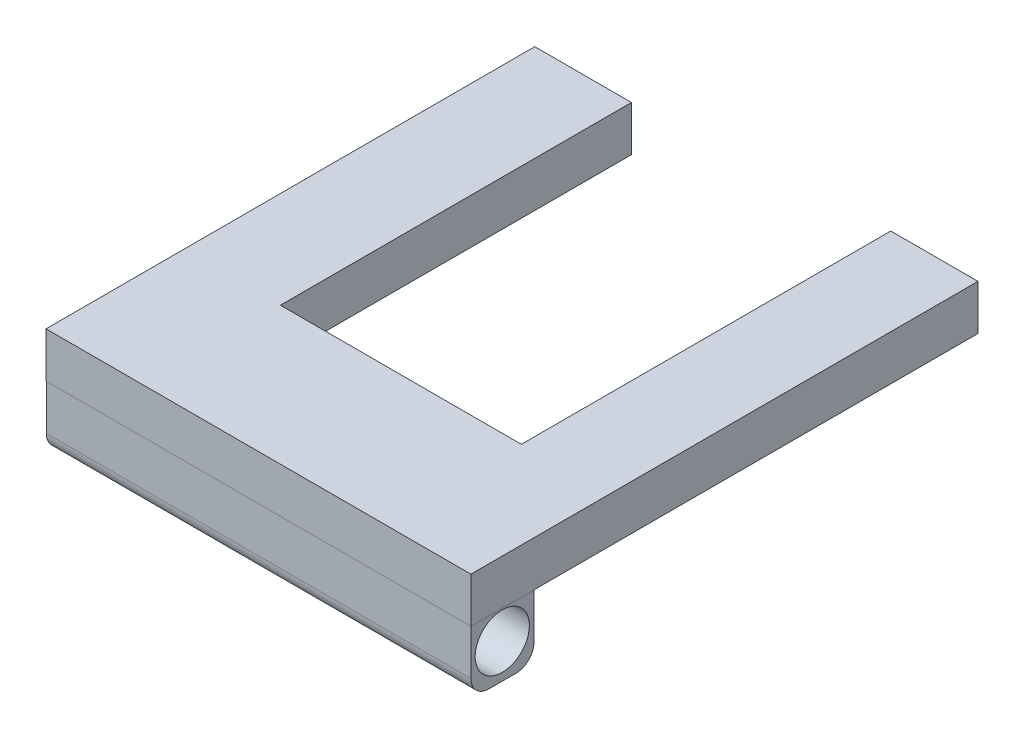
ISO-10303-21;
HEADER;
FILE_DESCRIPTION(('STEP AP214'),'2;1');
FILE_NAME('part.step','',(''),(''),'','','');
FILE_SCHEMA(('AUTOMOTIVE_DESIGN { 1 0 10303 214 1 1 1 1 }'));
ENDSEC;
DATA;
#1=APPLICATION_CONTEXT('core data for automotive mechanical design processes');
#2=APPLICATION_PROTOCOL_DEFINITION('international standard','automotive_design',2000,#1);
#3=PRODUCT_CONTEXT('',#1,'mechanical');
#4=PRODUCT('Part','Part','',(#3));
#5=PRODUCT_RELATED_PRODUCT_CATEGORY('part','',(#4));
#6=PRODUCT_DEFINITION_FORMATION('','',#4);
#7=PRODUCT_DEFINITION_CONTEXT('part definition',#1,'design');
#8=PRODUCT_DEFINITION('design','',#6,#7);
#9=PRODUCT_DEFINITION_SHAPE('','',#8);
#10=(LENGTH_UNIT() NAMED_UNIT(*) SI_UNIT(.MILLI.,.METRE.));
#11=(NAMED_UNIT(*) PLANE_ANGLE_UNIT() SI_UNIT($,.RADIAN.));
#12=(NAMED_UNIT(*) SI_UNIT($,.STERADIAN.) SOLID_ANGLE_UNIT());
#13=UNCERTAINTY_MEASURE_WITH_UNIT(LENGTH_MEASURE(1.E-05),#10,'distance_accuracy_value','');
#14=(GEOMETRIC_REPRESENTATION_CONTEXT(3) GLOBAL_UNCERTAINTY_ASSIGNED_CONTEXT((#13)) GLOBAL_UNIT_ASSIGNED_CONTEXT((#10,
#11,#12)) REPRESENTATION_CONTEXT('',''));
#15=CARTESIAN_POINT('',(0.,0.,0.));
#16=DIRECTION('',(0.,0.,1.));
#17=DIRECTION('',(1.,0.,0.));
#18=AXIS2_PLACEMENT_3D('',#15,#16,#17);
#19=CARTESIAN_POINT('',(0.0296784492588645,0.,54.1020000000002));
#20=DIRECTION('',(0.,0.,1.));
#21=DIRECTION('',(1.,0.,0.));
#22=AXIS2_PLACEMENT_3D('',#19,#20,#21);
#23=PLANE('',#22);
#24=DIRECTION('',(0.,-1.,0.));
#25=VECTOR('',#24,1.);
#26=CARTESIAN_POINT('',(0.0296784492588645,0.,54.1020000000002));
#27=LINE('',#26,#25);
#28=CARTESIAN_POINT('',(0.0296784492588645,0.,54.1020000000002));
#29=VERTEX_POINT('',#28);
#30=CARTESIAN_POINT('',(0.0296784492588645,-5.,54.1020000000002));
#31=VERTEX_POINT('',#30);
#32=EDGE_CURVE('E122',#29,#31,#27,.T.);
#33=ORIENTED_EDGE('',*,*,#32,.T.);
#34=DIRECTION('',(1.,0.,0.));
#35=VECTOR('',#34,1.);
#36=CARTESIAN_POINT('',(0.0296784492588645,-5.,54.1020000000002));
#37=LINE('',#36,#35);
#38=CARTESIAN_POINT('',(47.0296784492589,-5.,54.102));
#39=VERTEX_POINT('',#38);
#40=EDGE_CURVE('E12',#31,#39,#37,.T.);
#41=ORIENTED_EDGE('',*,*,#40,.T.);
#42=DIRECTION('',(0.,-1.,0.));
#43=VECTOR('',#42,1.);
#44=CARTESIAN_POINT('',(47.0296784492589,0.,54.102));
#45=LINE('',#44,#43);
#46=CARTESIAN_POINT('',(47.0296784492589,0.,54.102));
#47=VERTEX_POINT('',#46);
#48=EDGE_CURVE('E123',#47,#39,#45,.T.);
#49=ORIENTED_EDGE('',*,*,#48,.F.);
#50=DIRECTION('',(1.,0.,0.));
#51=VECTOR('',#50,1.);
#52=CARTESIAN_POINT('',(0.0296784492588645,0.,54.1020000000002));
#53=LINE('',#52,#51);
#54=EDGE_CURVE('E117',#29,#47,#53,.T.);
#55=ORIENTED_EDGE('',*,*,#54,.F.);
#56=EDGE_LOOP('',(#33,#41,#49,#55));
#57=FACE_BOUND('',#56,.T.);
#58=ADVANCED_FACE('F47',(#57),#23,.T.);
#59=CARTESIAN_POINT('',(0.0296784492588645,0.,54.1020000000002));
#60=DIRECTION('',(0.,1.,0.));
#61=DIRECTION('',(0.,0.,1.));
#62=AXIS2_PLACEMENT_3D('',#59,#60,#61);
#63=PLANE('',#62);
#64=DIRECTION('',(0.,0.,1.));
#65=VECTOR('',#64,1.);
#66=CARTESIAN_POINT('',(47.0296784492589,0.,54.102));
#67=LINE('',#66,#65);
#68=CARTESIAN_POINT('',(47.0296784492588,0.,47.102));
#69=VERTEX_POINT('',#68);
#70=EDGE_CURVE('E120',#69,#47,#67,.T.);
#71=ORIENTED_EDGE('',*,*,#70,.F.);
#72=DIRECTION('',(1.,0.,0.));
#73=VECTOR('',#72,1.);
#74=CARTESIAN_POINT('',(0.0296784492588367,0.,47.1020000000002));
#75=LINE('',#74,#73);
#76=CARTESIAN_POINT('',(0.0296784492588367,0.,47.1020000000002));
#77=VERTEX_POINT('',#76);
#78=EDGE_CURVE('E106',#77,#69,#75,.T.);
#79=ORIENTED_EDGE('',*,*,#78,.F.);
#80=DIRECTION('',(0.,0.,1.));
#81=VECTOR('',#80,1.);
#82=CARTESIAN_POINT('',(0.0296784492588645,0.,54.1020000000002));
#83=LINE('',#82,#81);
#84=EDGE_CURVE('E109',#77,#29,#83,.T.);
#85=ORIENTED_EDGE('',*,*,#84,.T.);
#86=ORIENTED_EDGE('',*,*,#54,.T.);
#87=EDGE_LOOP('',(#71,#79,#85,#86));
#88=FACE_BOUND('',#87,.T.);
#89=ADVANCED_FACE('F113',(#88),#63,.T.);
#90=CARTESIAN_POINT('',(0.0296784492588367,0.,47.1020000000002));
#91=DIRECTION('',(0.,0.,-1.));
#92=DIRECTION('',(-1.,0.,0.));
#93=AXIS2_PLACEMENT_3D('',#90,#91,#92);
#94=PLANE('',#93);
#95=DIRECTION('',(0.,1.,0.));
#96=VECTOR('',#95,1.);
#97=CARTESIAN_POINT('',(47.0296784492588,0.,47.102));
#98=LINE('',#97,#96);
#99=CARTESIAN_POINT('',(47.0296784492588,-5.,47.102));
#100=VERTEX_POINT('',#99);
#101=EDGE_CURVE('E135',#100,#69,#98,.T.);
#102=ORIENTED_EDGE('',*,*,#101,.F.);
#103=DIRECTION('',(1.,0.,0.));
#104=VECTOR('',#103,1.);
#105=CARTESIAN_POINT('',(0.0296784492588367,-5.,47.1020000000002));
#106=LINE('',#105,#104);
#107=CARTESIAN_POINT('',(0.0296784492588367,-5.,47.1020000000002));
#108=VERTEX_POINT('',#107);
#109=EDGE_CURVE('E75',#100,#108,#106,.F.);
#110=ORIENTED_EDGE('',*,*,#109,.T.);
#111=DIRECTION('',(0.,1.,0.));
#112=VECTOR('',#111,1.);
#113=CARTESIAN_POINT('',(0.0296784492588367,0.,47.1020000000002));
#114=LINE('',#113,#112);
#115=EDGE_CURVE('E103',#108,#77,#114,.T.);
#116=ORIENTED_EDGE('',*,*,#115,.T.);
#117=ORIENTED_EDGE('',*,*,#78,.T.);
#118=EDGE_LOOP('',(#102,#110,#116,#117));
#119=FACE_BOUND('',#118,.T.);
#120=ADVANCED_FACE('F104',(#119),#94,.T.);
#121=CARTESIAN_POINT('',(0.0296784492588645,-7.,54.1020000000002));
#122=DIRECTION('',(0.,-1.,0.));
#123=DIRECTION('',(0.,0.,-1.));
#124=AXIS2_PLACEMENT_3D('',#121,#122,#123);
#125=PLANE('',#124);
#126=DIRECTION('',(0.,0.,-1.));
#127=VECTOR('',#126,1.);
#128=CARTESIAN_POINT('',(0.0296784492588645,-7.,54.1020000000002));
#129=LINE('',#128,#127);
#130=CARTESIAN_POINT('',(0.0296784492588565,-7.,52.1020000000002));
#131=VERTEX_POINT('',#130);
#132=CARTESIAN_POINT('',(0.0296784492588447,-7.,49.1020000000002));
#133=VERTEX_POINT('',#132);
#134=EDGE_CURVE('E112',#131,#133,#129,.T.);
#135=ORIENTED_EDGE('',*,*,#134,.T.);
#136=DIRECTION('',(1.,0.,0.));
#137=VECTOR('',#136,1.);
#138=CARTESIAN_POINT('',(0.0296784492588472,-7.,49.1020000000002));
#139=LINE('',#138,#137);
#140=CARTESIAN_POINT('',(47.0296784492589,-7.,49.102));
#141=VERTEX_POINT('',#140);
#142=EDGE_CURVE('E140',#133,#141,#139,.T.);
#143=ORIENTED_EDGE('',*,*,#142,.T.);
#144=DIRECTION('',(0.,0.,-1.));
#145=VECTOR('',#144,1.);
#146=CARTESIAN_POINT('',(47.0296784492589,-7.,54.102));
#147=LINE('',#146,#145);
#148=CARTESIAN_POINT('',(47.0296784492589,-7.,52.102));
#149=VERTEX_POINT('',#148);
#150=EDGE_CURVE('E126',#149,#141,#147,.T.);
#151=ORIENTED_EDGE('',*,*,#150,.F.);
#152=DIRECTION('',(1.,0.,0.));
#153=VECTOR('',#152,1.);
#154=CARTESIAN_POINT('',(0.0296784492588576,-7.,52.1020000000002));
#155=LINE('',#154,#153);
#156=EDGE_CURVE('E134',#149,#131,#155,.F.);
#157=ORIENTED_EDGE('',*,*,#156,.T.);
#158=EDGE_LOOP('',(#135,#143,#151,#157));
#159=FACE_BOUND('',#158,.T.);
#160=ADVANCED_FACE('F147',(#159),#125,.T.);
#161=CARTESIAN_POINT('',(0.0296784492586494,0.,0.));
#162=DIRECTION('',(1.,0.,0.));
#163=DIRECTION('',(0.,0.,-1.));
#164=AXIS2_PLACEMENT_3D('',#161,#162,#163);
#165=PLANE('',#164);
#166=CARTESIAN_POINT('',(0.0296784492588501,-3.15486078848437,50.6263431609));
#167=DIRECTION('',(1.,0.,0.));
#168=DIRECTION('',(0.,0.,-1.));
#169=AXIS2_PLACEMENT_3D('',#166,#167,#168);
#170=CIRCLE('',#169,3.);
#171=CARTESIAN_POINT('',(0.0296784492588382,-3.15486078848437,47.6263431609));
#172=VERTEX_POINT('',#171);
#173=EDGE_CURVE('E129',#172,#172,#170,.F.);
#174=ORIENTED_EDGE('',*,*,#173,.F.);
#175=EDGE_LOOP('',(#174));
#176=FACE_BOUND('',#175,.T.);
#177=ORIENTED_EDGE('',*,*,#115,.F.);
#178=CARTESIAN_POINT('',(0.0296784492588441,-5.,49.1020000000002));
#179=DIRECTION('',(1.,0.,0.));
#180=DIRECTION('',(0.,0.,-1.));
#181=AXIS2_PLACEMENT_3D('',#178,#179,#180);
#182=CIRCLE('',#181,2.);
#183=EDGE_CURVE('E60',#108,#133,#182,.F.);
#184=ORIENTED_EDGE('',*,*,#183,.T.);
#185=ORIENTED_EDGE('',*,*,#134,.F.);
#186=CARTESIAN_POINT('',(0.029678449258856,-5.,52.1020000000002));
#187=DIRECTION('',(1.,0.,0.));
#188=DIRECTION('',(0.,0.,-1.));
#189=AXIS2_PLACEMENT_3D('',#186,#187,#188);
#190=CIRCLE('',#189,2.);
#191=EDGE_CURVE('E63',#131,#31,#190,.F.);
#192=ORIENTED_EDGE('',*,*,#191,.T.);
#193=ORIENTED_EDGE('',*,*,#32,.F.);
#194=ORIENTED_EDGE('',*,*,#84,.F.);
#195=EDGE_LOOP('',(#177,#184,#185,#192,#193,#194));
#196=FACE_BOUND('',#195,.T.);
#197=ADVANCED_FACE('F119',(#176,#196),#165,.F.);
#198=CARTESIAN_POINT('',(47.0296784492587,0.,-1.86476542339588E-13));
#199=DIRECTION('',(1.,0.,0.));
#200=DIRECTION('',(0.,0.,-1.));
#201=AXIS2_PLACEMENT_3D('',#198,#199,#200);
#202=PLANE('',#201);
#203=CARTESIAN_POINT('',(47.0296784492589,-3.15486078848437,50.6263431608998));
#204=DIRECTION('',(1.,0.,0.));
#205=DIRECTION('',(0.,0.,-1.));
#206=AXIS2_PLACEMENT_3D('',#203,#204,#205);
#207=CIRCLE('',#206,3.);
#208=CARTESIAN_POINT('',(47.0296784492588,-3.15486078848437,47.6263431608998));
#209=VERTEX_POINT('',#208);
#210=EDGE_CURVE('E163',#209,#209,#207,.T.);
#211=ORIENTED_EDGE('',*,*,#210,.F.);
#212=EDGE_LOOP('',(#211));
#213=FACE_BOUND('',#212,.T.);
#214=ORIENTED_EDGE('',*,*,#150,.T.);
#215=CARTESIAN_POINT('',(47.0296784492589,-5.,49.102));
#216=DIRECTION('',(1.,0.,0.));
#217=DIRECTION('',(0.,0.,-1.));
#218=AXIS2_PLACEMENT_3D('',#215,#216,#217);
#219=CIRCLE('',#218,2.);
#220=EDGE_CURVE('E141',#141,#100,#219,.T.);
#221=ORIENTED_EDGE('',*,*,#220,.T.);
#222=ORIENTED_EDGE('',*,*,#101,.T.);
#223=ORIENTED_EDGE('',*,*,#70,.T.);
#224=ORIENTED_EDGE('',*,*,#48,.T.);
#225=CARTESIAN_POINT('',(47.0296784492589,-5.,52.102));
#226=DIRECTION('',(1.,0.,0.));
#227=DIRECTION('',(0.,0.,-1.));
#228=AXIS2_PLACEMENT_3D('',#225,#226,#227);
#229=CIRCLE('',#228,2.);
#230=EDGE_CURVE('E143',#39,#149,#229,.T.);
#231=ORIENTED_EDGE('',*,*,#230,.T.);
#232=EDGE_LOOP('',(#214,#221,#222,#223,#224,#231));
#233=FACE_BOUND('',#232,.T.);
#234=ADVANCED_FACE('F154',(#213,#233),#202,.T.);
#235=CARTESIAN_POINT('',(-0.00100000000001488,-3.15486078848437,50.6263431609));
#236=DIRECTION('',(1.,0.,0.));
#237=DIRECTION('',(0.,0.,-1.));
#238=AXIS2_PLACEMENT_3D('',#235,#236,#237);
#239=CYLINDRICAL_SURFACE('',#238,3.);
#240=ORIENTED_EDGE('',*,*,#210,.T.);
#241=EDGE_LOOP('',(#240));
#242=FACE_BOUND('',#241,.T.);
#243=ORIENTED_EDGE('',*,*,#173,.T.);
#244=EDGE_LOOP('',(#243));
#245=FACE_BOUND('',#244,.T.);
#246=ADVANCED_FACE('F169',(#242,#245),#239,.F.);
#247=CARTESIAN_POINT('',(0.0296784492588472,-5.,49.1020000000002));
#248=DIRECTION('',(1.,0.,0.));
#249=DIRECTION('',(0.,0.,-1.));
#250=AXIS2_PLACEMENT_3D('',#247,#248,#249);
#251=CYLINDRICAL_SURFACE('',#250,2.);
#252=ORIENTED_EDGE('',*,*,#183,.F.);
#253=ORIENTED_EDGE('',*,*,#109,.F.);
#254=ORIENTED_EDGE('',*,*,#220,.F.);
#255=ORIENTED_EDGE('',*,*,#142,.F.);
#256=EDGE_LOOP('',(#252,#253,#254,#255));
#257=FACE_BOUND('',#256,.T.);
#258=ADVANCED_FACE('F153',(#257),#251,.T.);
#259=CARTESIAN_POINT('',(0.0296784492588576,-5.,52.1020000000002));
#260=DIRECTION('',(1.,0.,0.));
#261=DIRECTION('',(0.,0.,-1.));
#262=AXIS2_PLACEMENT_3D('',#259,#260,#261);
#263=CYLINDRICAL_SURFACE('',#262,2.);
#264=ORIENTED_EDGE('',*,*,#191,.F.);
#265=ORIENTED_EDGE('',*,*,#156,.F.);
#266=ORIENTED_EDGE('',*,*,#230,.F.);
#267=ORIENTED_EDGE('',*,*,#40,.F.);
#268=EDGE_LOOP('',(#264,#265,#266,#267));
#269=FACE_BOUND('',#268,.T.);
#270=ADVANCED_FACE('F51',(#269),#263,.T.);
#271=CLOSED_SHELL('',(#58,#89,#120,#160,#197,#234,#246,#258,#270));
#272=MANIFOLD_SOLID_BREP('B2',#271);
#273=CARTESIAN_POINT('',(10.7076784492589,5.,0.));
#274=DIRECTION('',(0.,0.,1.));
#275=DIRECTION('',(1.,0.,0.));
#276=AXIS2_PLACEMENT_3D('',#273,#274,#275);
#277=PLANE('',#276);
#278=DIRECTION('',(-1.,0.,0.));
#279=VECTOR('',#278,1.);
#280=CARTESIAN_POINT('',(10.7076784492589,0.,0.));
#281=LINE('',#280,#279);
#282=CARTESIAN_POINT('',(10.7076784492589,0.,0.));
#283=VERTEX_POINT('',#282);
#284=CARTESIAN_POINT('',(0.,0.,0.));
#285=VERTEX_POINT('',#284);
#286=EDGE_CURVE('E342',#283,#285,#281,.T.);
#287=ORIENTED_EDGE('',*,*,#286,.T.);
#288=DIRECTION('',(0.,-1.,0.));
#289=VECTOR('',#288,1.);
#290=CARTESIAN_POINT('',(0.,5.,0.));
#291=LINE('',#290,#289);
#292=CARTESIAN_POINT('',(0.,5.,0.));
#293=VERTEX_POINT('',#292);
#294=EDGE_CURVE('E50',#293,#285,#291,.T.);
#295=ORIENTED_EDGE('',*,*,#294,.F.);
#296=DIRECTION('',(-1.,0.,0.));
#297=VECTOR('',#296,1.);
#298=CARTESIAN_POINT('',(10.7076784492589,5.,0.));
#299=LINE('',#298,#297);
#300=CARTESIAN_POINT('',(10.7076784492589,5.,0.));
#301=VERTEX_POINT('',#300);
#302=EDGE_CURVE('E354',#301,#293,#299,.T.);
#303=ORIENTED_EDGE('',*,*,#302,.F.);
#304=DIRECTION('',(0.,-1.,0.));
#305=VECTOR('',#304,1.);
#306=CARTESIAN_POINT('',(10.7076784492589,5.,0.));
#307=LINE('',#306,#305);
#308=EDGE_CURVE('E340',#301,#283,#307,.T.);
#309=ORIENTED_EDGE('',*,*,#308,.T.);
#310=EDGE_LOOP('',(#287,#295,#303,#309));
#311=FACE_BOUND('',#310,.T.);
#312=ADVANCED_FACE('F244',(#311),#277,.F.);
#313=CARTESIAN_POINT('',(0.,5.,0.));
#314=DIRECTION('',(1.,0.,0.));
#315=DIRECTION('',(0.,0.,-1.));
#316=AXIS2_PLACEMENT_3D('',#313,#314,#315);
#317=PLANE('',#316);
#318=DIRECTION('',(0.,0.,1.));
#319=VECTOR('',#318,1.);
#320=CARTESIAN_POINT('',(0.,0.,0.));
#321=LINE('',#320,#319);
#322=CARTESIAN_POINT('',(0.,0.,54.102));
#323=VERTEX_POINT('',#322);
#324=EDGE_CURVE('E341',#285,#323,#321,.T.);
#325=ORIENTED_EDGE('',*,*,#324,.T.);
#326=DIRECTION('',(0.,-1.,0.));
#327=VECTOR('',#326,1.);
#328=CARTESIAN_POINT('',(0.,5.,54.102));
#329=LINE('',#328,#327);
#330=CARTESIAN_POINT('',(0.,5.,54.102));
#331=VERTEX_POINT('',#330);
#332=EDGE_CURVE('E251',#331,#323,#329,.T.);
#333=ORIENTED_EDGE('',*,*,#332,.F.);
#334=DIRECTION('',(0.,0.,1.));
#335=VECTOR('',#334,1.);
#336=CARTESIAN_POINT('',(0.,5.,0.));
#337=LINE('',#336,#335);
#338=EDGE_CURVE('E301',#293,#331,#337,.T.);
#339=ORIENTED_EDGE('',*,*,#338,.F.);
#340=ORIENTED_EDGE('',*,*,#294,.T.);
#341=EDGE_LOOP('',(#325,#333,#339,#340));
#342=FACE_BOUND('',#341,.T.);
#343=ADVANCED_FACE('F388',(#342),#317,.F.);
#344=CARTESIAN_POINT('',(0.,5.,54.102));
#345=DIRECTION('',(0.,0.,-1.));
#346=DIRECTION('',(-1.,0.,0.));
#347=AXIS2_PLACEMENT_3D('',#344,#345,#346);
#348=PLANE('',#347);
#349=DIRECTION('',(1.,0.,0.));
#350=VECTOR('',#349,1.);
#351=CARTESIAN_POINT('',(0.,0.,54.102));
#352=LINE('',#351,#350);
#353=CARTESIAN_POINT('',(47.0296784492589,0.,54.102));
#354=VERTEX_POINT('',#353);
#355=EDGE_CURVE('E347',#323,#354,#352,.T.);
#356=ORIENTED_EDGE('',*,*,#355,.T.);
#357=DIRECTION('',(0.,-1.,0.));
#358=VECTOR('',#357,1.);
#359=CARTESIAN_POINT('',(47.0296784492589,5.,54.102));
#360=LINE('',#359,#358);
#361=CARTESIAN_POINT('',(47.0296784492589,5.,54.102));
#362=VERTEX_POINT('',#361);
#363=EDGE_CURVE('E362',#362,#354,#360,.T.);
#364=ORIENTED_EDGE('',*,*,#363,.F.);
#365=DIRECTION('',(1.,0.,0.));
#366=VECTOR('',#365,1.);
#367=CARTESIAN_POINT('',(0.,5.,54.102));
#368=LINE('',#367,#366);
#369=EDGE_CURVE('E367',#331,#362,#368,.T.);
#370=ORIENTED_EDGE('',*,*,#369,.F.);
#371=ORIENTED_EDGE('',*,*,#332,.T.);
#372=EDGE_LOOP('',(#356,#364,#370,#371));
#373=FACE_BOUND('',#372,.T.);
#374=ADVANCED_FACE('F366',(#373),#348,.F.);
#375=CARTESIAN_POINT('',(47.0296784492589,5.,54.102));
#376=DIRECTION('',(-1.,0.,0.));
#377=DIRECTION('',(0.,0.,1.));
#378=AXIS2_PLACEMENT_3D('',#375,#376,#377);
#379=PLANE('',#378);
#380=DIRECTION('',(0.,0.,-1.));
#381=VECTOR('',#380,1.);
#382=CARTESIAN_POINT('',(47.0296784492589,0.,54.102));
#383=LINE('',#382,#381);
#384=CARTESIAN_POINT('',(47.0296784492587,0.,-2.03200000000001));
#385=VERTEX_POINT('',#384);
#386=EDGE_CURVE('E346',#354,#385,#383,.T.);
#387=ORIENTED_EDGE('',*,*,#386,.T.);
#388=DIRECTION('',(0.,-1.,0.));
#389=VECTOR('',#388,1.);
#390=CARTESIAN_POINT('',(47.0296784492587,5.,-2.03200000000001));
#391=LINE('',#390,#389);
#392=CARTESIAN_POINT('',(47.0296784492587,5.,-2.03200000000001));
#393=VERTEX_POINT('',#392);
#394=EDGE_CURVE('E356',#393,#385,#391,.T.);
#395=ORIENTED_EDGE('',*,*,#394,.F.);
#396=DIRECTION('',(0.,0.,-1.));
#397=VECTOR('',#396,1.);
#398=CARTESIAN_POINT('',(47.0296784492589,5.,54.102));
#399=LINE('',#398,#397);
#400=EDGE_CURVE('E385',#362,#393,#399,.T.);
#401=ORIENTED_EDGE('',*,*,#400,.F.);
#402=ORIENTED_EDGE('',*,*,#363,.T.);
#403=EDGE_LOOP('',(#387,#395,#401,#402));
#404=FACE_BOUND('',#403,.T.);
#405=ADVANCED_FACE('F378',(#404),#379,.F.);
#406=CARTESIAN_POINT('',(47.0296784492587,5.,-2.03200000000001));
#407=DIRECTION('',(0.,0.,1.));
#408=DIRECTION('',(1.,0.,0.));
#409=AXIS2_PLACEMENT_3D('',#406,#407,#408);
#410=PLANE('',#409);
#411=DIRECTION('',(-1.,0.,0.));
#412=VECTOR('',#411,1.);
#413=CARTESIAN_POINT('',(47.0296784492587,0.,-2.03200000000001));
#414=LINE('',#413,#412);
#415=CARTESIAN_POINT('',(37.3776784492589,0.,-2.03200000000001));
#416=VERTEX_POINT('',#415);
#417=EDGE_CURVE('E348',#385,#416,#414,.T.);
#418=ORIENTED_EDGE('',*,*,#417,.T.);
#419=DIRECTION('',(0.,-1.,0.));
#420=VECTOR('',#419,1.);
#421=CARTESIAN_POINT('',(37.3776784492589,5.,-2.03200000000001));
#422=LINE('',#421,#420);
#423=CARTESIAN_POINT('',(37.3776784492589,5.,-2.03200000000001));
#424=VERTEX_POINT('',#423);
#425=EDGE_CURVE('E335',#424,#416,#422,.T.);
#426=ORIENTED_EDGE('',*,*,#425,.F.);
#427=DIRECTION('',(-1.,0.,0.));
#428=VECTOR('',#427,1.);
#429=CARTESIAN_POINT('',(47.0296784492587,5.,-2.03200000000001));
#430=LINE('',#429,#428);
#431=EDGE_CURVE('E323',#393,#424,#430,.T.);
#432=ORIENTED_EDGE('',*,*,#431,.F.);
#433=ORIENTED_EDGE('',*,*,#394,.T.);
#434=EDGE_LOOP('',(#418,#426,#432,#433));
#435=FACE_BOUND('',#434,.T.);
#436=ADVANCED_FACE('F381',(#435),#410,.F.);
#437=CARTESIAN_POINT('',(37.3776784492589,5.,-2.03200000000001));
#438=DIRECTION('',(1.,0.,0.));
#439=DIRECTION('',(0.,0.,-1.));
#440=AXIS2_PLACEMENT_3D('',#437,#438,#439);
#441=PLANE('',#440);
#442=DIRECTION('',(0.,0.,1.));
#443=VECTOR('',#442,1.);
#444=CARTESIAN_POINT('',(37.3776784492589,0.,-2.03200000000001));
#445=LINE('',#444,#443);
#446=CARTESIAN_POINT('',(37.3776784492589,0.,38.862));
#447=VERTEX_POINT('',#446);
#448=EDGE_CURVE('E332',#416,#447,#445,.T.);
#449=ORIENTED_EDGE('',*,*,#448,.T.);
#450=DIRECTION('',(0.,-1.,0.));
#451=VECTOR('',#450,1.);
#452=CARTESIAN_POINT('',(37.3776784492589,5.,38.862));
#453=LINE('',#452,#451);
#454=CARTESIAN_POINT('',(37.3776784492589,5.,38.862));
#455=VERTEX_POINT('',#454);
#456=EDGE_CURVE('E327',#455,#447,#453,.T.);
#457=ORIENTED_EDGE('',*,*,#456,.F.);
#458=DIRECTION('',(0.,0.,1.));
#459=VECTOR('',#458,1.);
#460=CARTESIAN_POINT('',(37.3776784492589,5.,-2.03200000000001));
#461=LINE('',#460,#459);
#462=EDGE_CURVE('E320',#424,#455,#461,.T.);
#463=ORIENTED_EDGE('',*,*,#462,.F.);
#464=ORIENTED_EDGE('',*,*,#425,.T.);
#465=EDGE_LOOP('',(#449,#457,#463,#464));
#466=FACE_BOUND('',#465,.T.);
#467=ADVANCED_FACE('F328',(#466),#441,.F.);
#468=CARTESIAN_POINT('',(37.3776784492589,5.,38.862));
#469=DIRECTION('',(0.,0.,1.));
#470=DIRECTION('',(1.,0.,0.));
#471=AXIS2_PLACEMENT_3D('',#468,#469,#470);
#472=PLANE('',#471);
#473=DIRECTION('',(-1.,0.,0.));
#474=VECTOR('',#473,1.);
#475=CARTESIAN_POINT('',(37.3776784492589,0.,38.862));
#476=LINE('',#475,#474);
#477=CARTESIAN_POINT('',(10.7076784492589,0.,38.862));
#478=VERTEX_POINT('',#477);
#479=EDGE_CURVE('E288',#447,#478,#476,.T.);
#480=ORIENTED_EDGE('',*,*,#479,.T.);
#481=DIRECTION('',(0.,-1.,0.));
#482=VECTOR('',#481,1.);
#483=CARTESIAN_POINT('',(10.7076784492589,5.,38.862));
#484=LINE('',#483,#482);
#485=CARTESIAN_POINT('',(10.7076784492589,5.,38.862));
#486=VERTEX_POINT('',#485);
#487=EDGE_CURVE('E334',#486,#478,#484,.T.);
#488=ORIENTED_EDGE('',*,*,#487,.F.);
#489=DIRECTION('',(-1.,0.,0.));
#490=VECTOR('',#489,1.);
#491=CARTESIAN_POINT('',(37.3776784492589,5.,38.862));
#492=LINE('',#491,#490);
#493=EDGE_CURVE('E321',#455,#486,#492,.T.);
#494=ORIENTED_EDGE('',*,*,#493,.F.);
#495=ORIENTED_EDGE('',*,*,#456,.T.);
#496=EDGE_LOOP('',(#480,#488,#494,#495));
#497=FACE_BOUND('',#496,.T.);
#498=ADVANCED_FACE('F333',(#497),#472,.F.);
#499=CARTESIAN_POINT('',(10.7076784492589,5.,38.862));
#500=DIRECTION('',(-1.,0.,0.));
#501=DIRECTION('',(0.,0.,1.));
#502=AXIS2_PLACEMENT_3D('',#499,#500,#501);
#503=PLANE('',#502);
#504=DIRECTION('',(0.,0.,-1.));
#505=VECTOR('',#504,1.);
#506=CARTESIAN_POINT('',(10.7076784492589,0.,38.862));
#507=LINE('',#506,#505);
#508=EDGE_CURVE('E296',#478,#283,#507,.T.);
#509=ORIENTED_EDGE('',*,*,#508,.T.);
#510=ORIENTED_EDGE('',*,*,#308,.F.);
#511=DIRECTION('',(0.,0.,-1.));
#512=VECTOR('',#511,1.);
#513=CARTESIAN_POINT('',(10.7076784492589,5.,38.862));
#514=LINE('',#513,#512);
#515=EDGE_CURVE('E261',#486,#301,#514,.T.);
#516=ORIENTED_EDGE('',*,*,#515,.F.);
#517=ORIENTED_EDGE('',*,*,#487,.T.);
#518=EDGE_LOOP('',(#509,#510,#516,#517));
#519=FACE_BOUND('',#518,.T.);
#520=ADVANCED_FACE('F406',(#519),#503,.F.);
#521=CARTESIAN_POINT('',(0.,5.,0.));
#522=DIRECTION('',(0.,1.,0.));
#523=DIRECTION('',(0.,0.,1.));
#524=AXIS2_PLACEMENT_3D('',#521,#522,#523);
#525=PLANE('',#524);
#526=ORIENTED_EDGE('',*,*,#302,.T.);
#527=ORIENTED_EDGE('',*,*,#338,.T.);
#528=ORIENTED_EDGE('',*,*,#369,.T.);
#529=ORIENTED_EDGE('',*,*,#400,.T.);
#530=ORIENTED_EDGE('',*,*,#431,.T.);
#531=ORIENTED_EDGE('',*,*,#462,.T.);
#532=ORIENTED_EDGE('',*,*,#493,.T.);
#533=ORIENTED_EDGE('',*,*,#515,.T.);
#534=EDGE_LOOP('',(#526,#527,#528,#529,#530,#531,#532,#533));
#535=FACE_BOUND('',#534,.T.);
#536=ADVANCED_FACE('F317',(#535),#525,.T.);
#537=CARTESIAN_POINT('',(0.,0.,0.));
#538=DIRECTION('',(0.,1.,0.));
#539=DIRECTION('',(0.,0.,1.));
#540=AXIS2_PLACEMENT_3D('',#537,#538,#539);
#541=PLANE('',#540);
#542=ORIENTED_EDGE('',*,*,#286,.F.);
#543=ORIENTED_EDGE('',*,*,#508,.F.);
#544=ORIENTED_EDGE('',*,*,#479,.F.);
#545=ORIENTED_EDGE('',*,*,#448,.F.);
#546=ORIENTED_EDGE('',*,*,#417,.F.);
#547=ORIENTED_EDGE('',*,*,#386,.F.);
#548=ORIENTED_EDGE('',*,*,#355,.F.);
#549=ORIENTED_EDGE('',*,*,#324,.F.);
#550=EDGE_LOOP('',(#542,#543,#544,#545,#546,#547,#548,#549));
#551=FACE_BOUND('',#550,.T.);
#552=ADVANCED_FACE('F372',(#551),#541,.F.);
#553=CLOSED_SHELL('',(#312,#343,#374,#405,#436,#467,#498,#520,#536,#552));
#554=MANIFOLD_SOLID_BREP('B6',#553);
#555=ADVANCED_BREP_SHAPE_REPRESENTATION('',(#18,#272,#554),#14);
#556=SHAPE_DEFINITION_REPRESENTATION(#9,#555);
ENDSEC;
END-ISO-10303-21;
